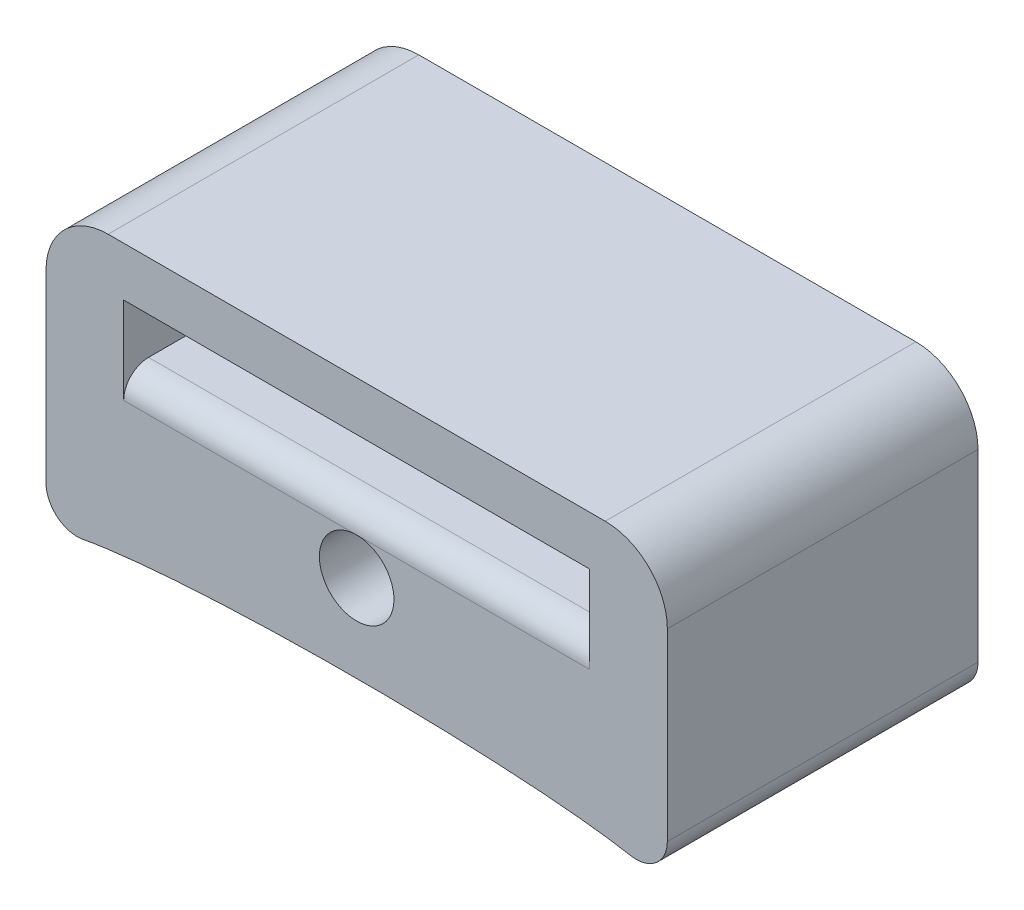
ISO-10303-21;
HEADER;
FILE_DESCRIPTION(('STEP AP214'),'2;1');
FILE_NAME('part.step','',(''),(''),'','','');
FILE_SCHEMA(('AUTOMOTIVE_DESIGN { 1 0 10303 214 1 1 1 1 }'));
ENDSEC;
DATA;
#1=APPLICATION_CONTEXT('core data for automotive mechanical design processes');
#2=APPLICATION_PROTOCOL_DEFINITION('international standard','automotive_design',2000,#1);
#3=PRODUCT_CONTEXT('',#1,'mechanical');
#4=PRODUCT('Part','Part','',(#3));
#5=PRODUCT_RELATED_PRODUCT_CATEGORY('part','',(#4));
#6=PRODUCT_DEFINITION_FORMATION('','',#4);
#7=PRODUCT_DEFINITION_CONTEXT('part definition',#1,'design');
#8=PRODUCT_DEFINITION('design','',#6,#7);
#9=PRODUCT_DEFINITION_SHAPE('','',#8);
#10=(LENGTH_UNIT() NAMED_UNIT(*) SI_UNIT(.MILLI.,.METRE.));
#11=(NAMED_UNIT(*) PLANE_ANGLE_UNIT() SI_UNIT($,.RADIAN.));
#12=(NAMED_UNIT(*) SI_UNIT($,.STERADIAN.) SOLID_ANGLE_UNIT());
#13=UNCERTAINTY_MEASURE_WITH_UNIT(LENGTH_MEASURE(1.E-05),#10,'distance_accuracy_value','');
#14=(GEOMETRIC_REPRESENTATION_CONTEXT(3) GLOBAL_UNCERTAINTY_ASSIGNED_CONTEXT((#13)) GLOBAL_UNIT_ASSIGNED_CONTEXT((#10,
#11,#12)) REPRESENTATION_CONTEXT('',''));
#15=CARTESIAN_POINT('',(0.,0.,0.));
#16=DIRECTION('',(0.,0.,1.));
#17=DIRECTION('',(1.,0.,0.));
#18=AXIS2_PLACEMENT_3D('',#15,#16,#17);
#19=CARTESIAN_POINT('',(-141.503596574538,5.,36.8424613526861));
#20=DIRECTION('',(1.,0.,0.));
#21=DIRECTION('',(0.,0.,-1.));
#22=AXIS2_PLACEMENT_3D('',#19,#20,#21);
#23=PLANE('',#22);
#24=DIRECTION('',(0.,-1.,0.));
#25=VECTOR('',#24,1.);
#26=CARTESIAN_POINT('',(-141.503596574538,5.,41.842461352686));
#27=LINE('',#26,#25);
#28=CARTESIAN_POINT('',(-141.503596574538,3.69200046956964,41.842461352686));
#29=VERTEX_POINT('',#28);
#30=CARTESIAN_POINT('',(-141.503596574538,0.727461803349973,41.842461352686));
#31=VERTEX_POINT('',#30);
#32=EDGE_CURVE('E215',#29,#31,#27,.T.);
#33=ORIENTED_EDGE('',*,*,#32,.F.);
#34=DIRECTION('',(0.,0.,1.));
#35=VECTOR('',#34,1.);
#36=CARTESIAN_POINT('',(-141.503596574538,3.69200046956964,36.8424613526861));
#37=LINE('',#36,#35);
#38=CARTESIAN_POINT('',(-141.503596574538,3.69200046956964,36.8424613526861));
#39=VERTEX_POINT('',#38);
#40=EDGE_CURVE('E272',#29,#39,#37,.F.);
#41=ORIENTED_EDGE('',*,*,#40,.T.);
#42=DIRECTION('',(0.,-1.,0.));
#43=VECTOR('',#42,1.);
#44=CARTESIAN_POINT('',(-141.503596574538,5.,36.8424613526861));
#45=LINE('',#44,#43);
#46=CARTESIAN_POINT('',(-141.503596574538,0.727461803349973,36.8424613526861));
#47=VERTEX_POINT('',#46);
#48=EDGE_CURVE('E206',#39,#47,#45,.T.);
#49=ORIENTED_EDGE('',*,*,#48,.T.);
#50=DIRECTION('',(0.,0.,1.));
#51=VECTOR('',#50,1.);
#52=CARTESIAN_POINT('',(-141.503596574538,0.727461803349973,36.8424613526861));
#53=LINE('',#52,#51);
#54=EDGE_CURVE('E231',#47,#31,#53,.T.);
#55=ORIENTED_EDGE('',*,*,#54,.T.);
#56=EDGE_LOOP('',(#33,#41,#49,#55));
#57=FACE_BOUND('',#56,.T.);
#58=ADVANCED_FACE('F45',(#57),#23,.F.);
#59=CARTESIAN_POINT('',(-141.503596574538,5.,41.842461352686));
#60=DIRECTION('',(0.,0.,-1.));
#61=DIRECTION('',(-1.,0.,0.));
#62=AXIS2_PLACEMENT_3D('',#59,#60,#61);
#63=PLANE('',#62);
#64=DIRECTION('',(0.,1.,0.));
#65=VECTOR('',#64,1.);
#66=CARTESIAN_POINT('',(-132.753596574538,0.,41.842461352686));
#67=LINE('',#66,#65);
#68=CARTESIAN_POINT('',(-132.753596574538,2.49999999999999,41.842461352686));
#69=VERTEX_POINT('',#68);
#70=CARTESIAN_POINT('',(-132.753596574538,3.89999999999999,41.842461352686));
#71=VERTEX_POINT('',#70);
#72=EDGE_CURVE('E166',#69,#71,#67,.T.);
#73=ORIENTED_EDGE('',*,*,#72,.F.);
#74=DIRECTION('',(1.,0.,0.));
#75=VECTOR('',#74,1.);
#76=CARTESIAN_POINT('',(-141.503596574538,2.49999999999999,41.842461352686));
#77=LINE('',#76,#75);
#78=CARTESIAN_POINT('',(-136.503596574538,2.49999999999999,41.842461352686));
#79=VERTEX_POINT('',#78);
#80=EDGE_CURVE('E295',#69,#79,#77,.F.);
#81=ORIENTED_EDGE('',*,*,#80,.T.);
#82=CARTESIAN_POINT('',(-136.503596574538,1.9,41.842461352686));
#83=DIRECTION('',(0.,0.,1.));
#84=DIRECTION('',(1.,0.,0.));
#85=AXIS2_PLACEMENT_3D('',#82,#83,#84);
#86=CIRCLE('',#85,0.599999999999993);
#87=EDGE_CURVE('E197',#79,#79,#86,.T.);
#88=ORIENTED_EDGE('',*,*,#87,.F.);
#89=DIRECTION('',(1.,0.,0.));
#90=VECTOR('',#89,1.);
#91=CARTESIAN_POINT('',(-141.503596574538,2.49999999999999,41.842461352686));
#92=LINE('',#91,#90);
#93=CARTESIAN_POINT('',(-140.253596574538,2.49999999999999,41.842461352686));
#94=VERTEX_POINT('',#93);
#95=EDGE_CURVE('E292',#79,#94,#92,.F.);
#96=ORIENTED_EDGE('',*,*,#95,.T.);
#97=DIRECTION('',(0.,1.,0.));
#98=VECTOR('',#97,1.);
#99=CARTESIAN_POINT('',(-140.253596574538,0.,41.842461352686));
#100=LINE('',#99,#98);
#101=CARTESIAN_POINT('',(-140.253596574538,3.89999999999999,41.842461352686));
#102=VERTEX_POINT('',#101);
#103=EDGE_CURVE('E178',#94,#102,#100,.T.);
#104=ORIENTED_EDGE('',*,*,#103,.T.);
#105=DIRECTION('',(1.,0.,0.));
#106=VECTOR('',#105,1.);
#107=CARTESIAN_POINT('',(0.,3.89999999999999,41.842461352686));
#108=LINE('',#107,#106);
#109=EDGE_CURVE('E158',#102,#71,#108,.T.);
#110=ORIENTED_EDGE('',*,*,#109,.T.);
#111=EDGE_LOOP('',(#73,#81,#88,#96,#104,#110));
#112=FACE_BOUND('',#111,.T.);
#113=DIRECTION('',(-1.,0.,0.));
#114=VECTOR('',#113,1.);
#115=CARTESIAN_POINT('',(0.,4.69200046956964,41.842461352686));
#116=LINE('',#115,#114);
#117=CARTESIAN_POINT('',(-132.503596574538,4.69200046956964,41.842461352686));
#118=VERTEX_POINT('',#117);
#119=CARTESIAN_POINT('',(-140.503596574538,4.69200046956964,41.842461352686));
#120=VERTEX_POINT('',#119);
#121=EDGE_CURVE('E173',#118,#120,#116,.T.);
#122=ORIENTED_EDGE('',*,*,#121,.T.);
#123=CARTESIAN_POINT('',(-140.503596574538,3.69200046956964,41.842461352686));
#124=DIRECTION('',(0.,0.,-1.));
#125=DIRECTION('',(-1.,0.,0.));
#126=AXIS2_PLACEMENT_3D('',#123,#124,#125);
#127=CIRCLE('',#126,1.);
#128=EDGE_CURVE('E269',#120,#29,#127,.F.);
#129=ORIENTED_EDGE('',*,*,#128,.T.);
#130=ORIENTED_EDGE('',*,*,#32,.T.);
#131=CARTESIAN_POINT('',(-141.003596574538,0.727461803349973,41.842461352686));
#132=DIRECTION('',(0.,0.,-1.));
#133=DIRECTION('',(-1.,0.,0.));
#134=AXIS2_PLACEMENT_3D('',#131,#132,#133);
#135=CIRCLE('',#134,0.5);
#136=CARTESIAN_POINT('',(-140.911777495764,0.235964848351188,41.842461352686));
#137=VERTEX_POINT('',#136);
#138=EDGE_CURVE('E239',#31,#137,#135,.F.);
#139=ORIENTED_EDGE('',*,*,#138,.T.);
#140=CARTESIAN_POINT('',(-136.503596574538,0.,41.842461352686));
#141=DIRECTION('',(0.,0.,1.));
#142=DIRECTION('',(1.,0.,0.));
#143=AXIS2_PLACEMENT_3D('',#140,#141,#142);
#144=ELLIPSE('',#143,5.,0.5);
#145=CARTESIAN_POINT('',(-132.095415653312,0.235964848351188,41.842461352686));
#146=VERTEX_POINT('',#145);
#147=EDGE_CURVE('E189',#146,#137,#144,.T.);
#148=ORIENTED_EDGE('',*,*,#147,.F.);
#149=CARTESIAN_POINT('',(-132.003596574538,0.727461803349973,41.842461352686));
#150=DIRECTION('',(0.,0.,-1.));
#151=DIRECTION('',(-1.,0.,0.));
#152=AXIS2_PLACEMENT_3D('',#149,#150,#151);
#153=CIRCLE('',#152,0.5);
#154=CARTESIAN_POINT('',(-131.503596574538,0.727461803349973,41.842461352686));
#155=VERTEX_POINT('',#154);
#156=EDGE_CURVE('E235',#146,#155,#153,.F.);
#157=ORIENTED_EDGE('',*,*,#156,.T.);
#158=DIRECTION('',(0.,-1.,0.));
#159=VECTOR('',#158,1.);
#160=CARTESIAN_POINT('',(-131.503596574538,5.,41.842461352686));
#161=LINE('',#160,#159);
#162=CARTESIAN_POINT('',(-131.503596574538,3.69200046956964,41.842461352686));
#163=VERTEX_POINT('',#162);
#164=EDGE_CURVE('E212',#163,#155,#161,.T.);
#165=ORIENTED_EDGE('',*,*,#164,.F.);
#166=CARTESIAN_POINT('',(-132.503596574538,3.69200046956964,41.842461352686));
#167=DIRECTION('',(0.,0.,-1.));
#168=DIRECTION('',(-1.,0.,0.));
#169=AXIS2_PLACEMENT_3D('',#166,#167,#168);
#170=CIRCLE('',#169,1.);
#171=EDGE_CURVE('E266',#163,#118,#170,.F.);
#172=ORIENTED_EDGE('',*,*,#171,.T.);
#173=EDGE_LOOP('',(#122,#129,#130,#139,#148,#157,#165,#172));
#174=FACE_BOUND('',#173,.T.);
#175=ADVANCED_FACE('F175',(#112,#174),#63,.F.);
#176=CARTESIAN_POINT('',(-131.503596574538,5.,36.8424613526861));
#177=DIRECTION('',(-1.,0.,0.));
#178=DIRECTION('',(0.,0.,1.));
#179=AXIS2_PLACEMENT_3D('',#176,#177,#178);
#180=PLANE('',#179);
#181=DIRECTION('',(0.,-1.,0.));
#182=VECTOR('',#181,1.);
#183=CARTESIAN_POINT('',(-131.503596574538,5.,36.8424613526861));
#184=LINE('',#183,#182);
#185=CARTESIAN_POINT('',(-131.503596574538,3.69200046956964,36.8424613526861));
#186=VERTEX_POINT('',#185);
#187=CARTESIAN_POINT('',(-131.503596574538,0.727461803349973,36.8424613526861));
#188=VERTEX_POINT('',#187);
#189=EDGE_CURVE('E209',#186,#188,#184,.T.);
#190=ORIENTED_EDGE('',*,*,#189,.F.);
#191=DIRECTION('',(0.,0.,1.));
#192=VECTOR('',#191,1.);
#193=CARTESIAN_POINT('',(-131.503596574538,3.69200046956964,41.842461352686));
#194=LINE('',#193,#192);
#195=EDGE_CURVE('E281',#186,#163,#194,.T.);
#196=ORIENTED_EDGE('',*,*,#195,.T.);
#197=ORIENTED_EDGE('',*,*,#164,.T.);
#198=DIRECTION('',(0.,0.,1.));
#199=VECTOR('',#198,1.);
#200=CARTESIAN_POINT('',(-131.503596574538,0.727461803349973,36.8424613526861));
#201=LINE('',#200,#199);
#202=EDGE_CURVE('E255',#155,#188,#201,.F.);
#203=ORIENTED_EDGE('',*,*,#202,.T.);
#204=EDGE_LOOP('',(#190,#196,#197,#203));
#205=FACE_BOUND('',#204,.T.);
#206=ADVANCED_FACE('F337',(#205),#180,.F.);
#207=CARTESIAN_POINT('',(-141.503596574538,5.,36.8424613526861));
#208=DIRECTION('',(0.,0.,1.));
#209=DIRECTION('',(1.,0.,0.));
#210=AXIS2_PLACEMENT_3D('',#207,#208,#209);
#211=PLANE('',#210);
#212=DIRECTION('',(1.,0.,0.));
#213=VECTOR('',#212,1.);
#214=CARTESIAN_POINT('',(-141.503596574538,2.49999999999999,36.8424613526861));
#215=LINE('',#214,#213);
#216=CARTESIAN_POINT('',(-136.503596574538,2.49999999999999,36.8424613526861));
#217=VERTEX_POINT('',#216);
#218=CARTESIAN_POINT('',(-132.753596574538,2.49999999999999,36.8424613526861));
#219=VERTEX_POINT('',#218);
#220=EDGE_CURVE('E301',#217,#219,#215,.T.);
#221=ORIENTED_EDGE('',*,*,#220,.T.);
#222=DIRECTION('',(0.,1.,0.));
#223=VECTOR('',#222,1.);
#224=CARTESIAN_POINT('',(-132.753596574538,5.,36.8424613526861));
#225=LINE('',#224,#223);
#226=CARTESIAN_POINT('',(-132.753596574538,3.89999999999999,36.8424613526861));
#227=VERTEX_POINT('',#226);
#228=EDGE_CURVE('E61',#219,#227,#225,.T.);
#229=ORIENTED_EDGE('',*,*,#228,.T.);
#230=DIRECTION('',(1.,0.,0.));
#231=VECTOR('',#230,1.);
#232=CARTESIAN_POINT('',(-141.503596574538,3.89999999999999,36.8424613526861));
#233=LINE('',#232,#231);
#234=CARTESIAN_POINT('',(-140.253596574538,3.89999999999999,36.8424613526861));
#235=VERTEX_POINT('',#234);
#236=EDGE_CURVE('E160',#235,#227,#233,.T.);
#237=ORIENTED_EDGE('',*,*,#236,.F.);
#238=DIRECTION('',(0.,1.,0.));
#239=VECTOR('',#238,1.);
#240=CARTESIAN_POINT('',(-140.253596574538,5.,36.8424613526861));
#241=LINE('',#240,#239);
#242=CARTESIAN_POINT('',(-140.253596574538,2.49999999999999,36.8424613526861));
#243=VERTEX_POINT('',#242);
#244=EDGE_CURVE('E69',#243,#235,#241,.T.);
#245=ORIENTED_EDGE('',*,*,#244,.F.);
#246=DIRECTION('',(1.,0.,0.));
#247=VECTOR('',#246,1.);
#248=CARTESIAN_POINT('',(-141.503596574538,2.49999999999999,36.8424613526861));
#249=LINE('',#248,#247);
#250=EDGE_CURVE('E298',#243,#217,#249,.T.);
#251=ORIENTED_EDGE('',*,*,#250,.T.);
#252=CARTESIAN_POINT('',(-136.503596574538,1.9,36.8424613526861));
#253=DIRECTION('',(0.,0.,1.));
#254=DIRECTION('',(1.,0.,0.));
#255=AXIS2_PLACEMENT_3D('',#252,#253,#254);
#256=CIRCLE('',#255,0.599999999999993);
#257=EDGE_CURVE('E205',#217,#217,#256,.T.);
#258=ORIENTED_EDGE('',*,*,#257,.T.);
#259=EDGE_LOOP('',(#221,#229,#237,#245,#251,#258));
#260=FACE_BOUND('',#259,.T.);
#261=ORIENTED_EDGE('',*,*,#48,.F.);
#262=CARTESIAN_POINT('',(-140.503596574538,3.69200046956964,36.8424613526861));
#263=DIRECTION('',(0.,0.,1.));
#264=DIRECTION('',(1.,0.,0.));
#265=AXIS2_PLACEMENT_3D('',#262,#263,#264);
#266=CIRCLE('',#265,1.);
#267=CARTESIAN_POINT('',(-140.503596574538,4.69200046956964,36.8424613526861));
#268=VERTEX_POINT('',#267);
#269=EDGE_CURVE('E278',#39,#268,#266,.F.);
#270=ORIENTED_EDGE('',*,*,#269,.T.);
#271=DIRECTION('',(-1.,0.,0.));
#272=VECTOR('',#271,1.);
#273=CARTESIAN_POINT('',(-141.503596574538,4.69200046956964,36.8424613526861));
#274=LINE('',#273,#272);
#275=CARTESIAN_POINT('',(-132.503596574538,4.69200046956964,36.8424613526861));
#276=VERTEX_POINT('',#275);
#277=EDGE_CURVE('E218',#276,#268,#274,.T.);
#278=ORIENTED_EDGE('',*,*,#277,.F.);
#279=CARTESIAN_POINT('',(-132.503596574538,3.69200046956964,36.8424613526861));
#280=DIRECTION('',(0.,0.,1.));
#281=DIRECTION('',(1.,0.,0.));
#282=AXIS2_PLACEMENT_3D('',#279,#280,#281);
#283=CIRCLE('',#282,1.);
#284=EDGE_CURVE('E275',#276,#186,#283,.F.);
#285=ORIENTED_EDGE('',*,*,#284,.T.);
#286=ORIENTED_EDGE('',*,*,#189,.T.);
#287=CARTESIAN_POINT('',(-132.003596574538,0.727461803349973,36.8424613526861));
#288=DIRECTION('',(0.,0.,1.));
#289=DIRECTION('',(1.,0.,0.));
#290=AXIS2_PLACEMENT_3D('',#287,#288,#289);
#291=CIRCLE('',#290,0.5);
#292=CARTESIAN_POINT('',(-132.095415653312,0.235964848351188,36.8424613526861));
#293=VERTEX_POINT('',#292);
#294=EDGE_CURVE('E248',#188,#293,#291,.F.);
#295=ORIENTED_EDGE('',*,*,#294,.T.);
#296=CARTESIAN_POINT('',(-136.503596574538,0.,36.8424613526861));
#297=DIRECTION('',(0.,0.,1.));
#298=DIRECTION('',(1.,0.,0.));
#299=AXIS2_PLACEMENT_3D('',#296,#297,#298);
#300=ELLIPSE('',#299,5.,0.5);
#301=CARTESIAN_POINT('',(-140.911777495764,0.235964848351188,36.8424613526861));
#302=VERTEX_POINT('',#301);
#303=EDGE_CURVE('E201',#293,#302,#300,.T.);
#304=ORIENTED_EDGE('',*,*,#303,.T.);
#305=CARTESIAN_POINT('',(-141.003596574538,0.727461803349973,36.8424613526861));
#306=DIRECTION('',(0.,0.,1.));
#307=DIRECTION('',(1.,0.,0.));
#308=AXIS2_PLACEMENT_3D('',#305,#306,#307);
#309=CIRCLE('',#308,0.5);
#310=EDGE_CURVE('E251',#302,#47,#309,.F.);
#311=ORIENTED_EDGE('',*,*,#310,.T.);
#312=EDGE_LOOP('',(#261,#270,#278,#285,#286,#295,#304,#311));
#313=FACE_BOUND('',#312,.T.);
#314=ADVANCED_FACE('F334',(#260,#313),#211,.F.);
#315=CARTESIAN_POINT('',(-136.503596574538,0.,31.842461352686));
#316=DIRECTION('',(0.,0.,1.));
#317=DIRECTION('',(1.,0.,0.));
#318=AXIS2_PLACEMENT_3D('',#315,#316,#317);
#319=ELLIPSE('',#318,5.,0.5);
#320=DIRECTION('',(0.,0.,1.));
#321=VECTOR('',#320,1.);
#322=SURFACE_OF_LINEAR_EXTRUSION('',#319,#321);
#323=ORIENTED_EDGE('',*,*,#147,.T.);
#324=DIRECTION('',(0.,0.,1.));
#325=VECTOR('',#324,1.);
#326=CARTESIAN_POINT('',(-140.911777495764,0.235964848351188,41.842461352686));
#327=LINE('',#326,#325);
#328=EDGE_CURVE('E245',#137,#302,#327,.F.);
#329=ORIENTED_EDGE('',*,*,#328,.T.);
#330=ORIENTED_EDGE('',*,*,#303,.F.);
#331=DIRECTION('',(0.,0.,1.));
#332=VECTOR('',#331,1.);
#333=CARTESIAN_POINT('',(-132.095415653312,0.235964848351188,36.8424613526861));
#334=LINE('',#333,#332);
#335=EDGE_CURVE('E242',#293,#146,#334,.T.);
#336=ORIENTED_EDGE('',*,*,#335,.T.);
#337=EDGE_LOOP('',(#323,#329,#330,#336));
#338=FACE_BOUND('',#337,.T.);
#339=ADVANCED_FACE('F331',(#338),#322,.F.);
#340=CARTESIAN_POINT('',(-136.503596574538,1.9,31.842461352686));
#341=DIRECTION('',(0.,0.,1.));
#342=DIRECTION('',(1.,0.,0.));
#343=AXIS2_PLACEMENT_3D('',#340,#341,#342);
#344=CYLINDRICAL_SURFACE('',#343,0.599999999999993);
#345=ORIENTED_EDGE('',*,*,#87,.T.);
#346=EDGE_LOOP('',(#345));
#347=FACE_BOUND('',#346,.T.);
#348=ORIENTED_EDGE('',*,*,#257,.F.);
#349=EDGE_LOOP('',(#348));
#350=FACE_BOUND('',#349,.T.);
#351=ADVANCED_FACE('F327',(#347,#350),#344,.F.);
#352=CARTESIAN_POINT('',(0.,4.69200046956964,31.842461352686));
#353=DIRECTION('',(0.,1.,0.));
#354=DIRECTION('',(0.,0.,1.));
#355=AXIS2_PLACEMENT_3D('',#352,#353,#354);
#356=PLANE('',#355);
#357=ORIENTED_EDGE('',*,*,#277,.T.);
#358=DIRECTION('',(0.,0.,1.));
#359=VECTOR('',#358,1.);
#360=CARTESIAN_POINT('',(-140.503596574538,4.69200046956964,41.842461352686));
#361=LINE('',#360,#359);
#362=EDGE_CURVE('E262',#268,#120,#361,.T.);
#363=ORIENTED_EDGE('',*,*,#362,.T.);
#364=ORIENTED_EDGE('',*,*,#121,.F.);
#365=DIRECTION('',(0.,0.,1.));
#366=VECTOR('',#365,1.);
#367=CARTESIAN_POINT('',(-132.503596574538,4.69200046956964,36.8424613526861));
#368=LINE('',#367,#366);
#369=EDGE_CURVE('E259',#118,#276,#368,.F.);
#370=ORIENTED_EDGE('',*,*,#369,.T.);
#371=EDGE_LOOP('',(#357,#363,#364,#370));
#372=FACE_BOUND('',#371,.T.);
#373=ADVANCED_FACE('F330',(#372),#356,.T.);
#374=CARTESIAN_POINT('',(0.,2.89999999999999,31.842461352686));
#375=DIRECTION('',(0.,-1.,0.));
#376=DIRECTION('',(0.,0.,-1.));
#377=AXIS2_PLACEMENT_3D('',#374,#375,#376);
#378=PLANE('',#377);
#379=DIRECTION('',(0.,0.,1.));
#380=VECTOR('',#379,1.);
#381=CARTESIAN_POINT('',(-140.253596574538,2.89999999999999,31.842461352686));
#382=LINE('',#381,#380);
#383=CARTESIAN_POINT('',(-140.253596574538,2.89999999999999,37.242461352686));
#384=VERTEX_POINT('',#383);
#385=CARTESIAN_POINT('',(-140.253596574538,2.89999999999999,41.442461352686));
#386=VERTEX_POINT('',#385);
#387=EDGE_CURVE('E185',#384,#386,#382,.T.);
#388=ORIENTED_EDGE('',*,*,#387,.T.);
#389=DIRECTION('',(1.,0.,0.));
#390=VECTOR('',#389,1.);
#391=CARTESIAN_POINT('',(0.,2.89999999999999,41.442461352686));
#392=LINE('',#391,#390);
#393=CARTESIAN_POINT('',(-132.753596574538,2.89999999999999,41.442461352686));
#394=VERTEX_POINT('',#393);
#395=EDGE_CURVE('E288',#386,#394,#392,.T.);
#396=ORIENTED_EDGE('',*,*,#395,.T.);
#397=DIRECTION('',(0.,0.,1.));
#398=VECTOR('',#397,1.);
#399=CARTESIAN_POINT('',(-132.753596574538,2.89999999999999,31.842461352686));
#400=LINE('',#399,#398);
#401=CARTESIAN_POINT('',(-132.753596574538,2.89999999999999,37.242461352686));
#402=VERTEX_POINT('',#401);
#403=EDGE_CURVE('E163',#402,#394,#400,.T.);
#404=ORIENTED_EDGE('',*,*,#403,.F.);
#405=DIRECTION('',(1.,0.,0.));
#406=VECTOR('',#405,1.);
#407=CARTESIAN_POINT('',(0.,2.89999999999999,37.242461352686));
#408=LINE('',#407,#406);
#409=EDGE_CURVE('E285',#402,#384,#408,.F.);
#410=ORIENTED_EDGE('',*,*,#409,.T.);
#411=EDGE_LOOP('',(#388,#396,#404,#410));
#412=FACE_BOUND('',#411,.T.);
#413=ADVANCED_FACE('F314',(#412),#378,.F.);
#414=CARTESIAN_POINT('',(-140.253596574538,0.,31.842461352686));
#415=DIRECTION('',(1.,0.,0.));
#416=DIRECTION('',(0.,0.,-1.));
#417=AXIS2_PLACEMENT_3D('',#414,#415,#416);
#418=PLANE('',#417);
#419=ORIENTED_EDGE('',*,*,#244,.T.);
#420=DIRECTION('',(0.,0.,1.));
#421=VECTOR('',#420,1.);
#422=CARTESIAN_POINT('',(-140.253596574538,3.89999999999999,31.842461352686));
#423=LINE('',#422,#421);
#424=EDGE_CURVE('E162',#235,#102,#423,.T.);
#425=ORIENTED_EDGE('',*,*,#424,.T.);
#426=ORIENTED_EDGE('',*,*,#103,.F.);
#427=CARTESIAN_POINT('',(-140.253596574538,2.49999999999999,41.442461352686));
#428=DIRECTION('',(1.,0.,0.));
#429=DIRECTION('',(0.,0.,-1.));
#430=AXIS2_PLACEMENT_3D('',#427,#428,#429);
#431=CIRCLE('',#430,0.4);
#432=EDGE_CURVE('E306',#94,#386,#431,.F.);
#433=ORIENTED_EDGE('',*,*,#432,.T.);
#434=ORIENTED_EDGE('',*,*,#387,.F.);
#435=CARTESIAN_POINT('',(-140.253596574538,2.49999999999999,37.242461352686));
#436=DIRECTION('',(1.,0.,0.));
#437=DIRECTION('',(0.,0.,-1.));
#438=AXIS2_PLACEMENT_3D('',#435,#436,#437);
#439=CIRCLE('',#438,0.4);
#440=EDGE_CURVE('E11',#384,#243,#439,.F.);
#441=ORIENTED_EDGE('',*,*,#440,.T.);
#442=EDGE_LOOP('',(#419,#425,#426,#433,#434,#441));
#443=FACE_BOUND('',#442,.T.);
#444=ADVANCED_FACE('F320',(#443),#418,.T.);
#445=CARTESIAN_POINT('',(0.,3.89999999999999,31.842461352686));
#446=DIRECTION('',(0.,-1.,0.));
#447=DIRECTION('',(0.,0.,-1.));
#448=AXIS2_PLACEMENT_3D('',#445,#446,#447);
#449=PLANE('',#448);
#450=ORIENTED_EDGE('',*,*,#236,.T.);
#451=DIRECTION('',(0.,0.,1.));
#452=VECTOR('',#451,1.);
#453=CARTESIAN_POINT('',(-132.753596574538,3.89999999999999,31.842461352686));
#454=LINE('',#453,#452);
#455=EDGE_CURVE('E153',#227,#71,#454,.T.);
#456=ORIENTED_EDGE('',*,*,#455,.T.);
#457=ORIENTED_EDGE('',*,*,#109,.F.);
#458=ORIENTED_EDGE('',*,*,#424,.F.);
#459=EDGE_LOOP('',(#450,#456,#457,#458));
#460=FACE_BOUND('',#459,.T.);
#461=ADVANCED_FACE('F155',(#460),#449,.T.);
#462=CARTESIAN_POINT('',(-132.753596574538,0.,31.842461352686));
#463=DIRECTION('',(1.,0.,0.));
#464=DIRECTION('',(0.,0.,-1.));
#465=AXIS2_PLACEMENT_3D('',#462,#463,#464);
#466=PLANE('',#465);
#467=ORIENTED_EDGE('',*,*,#228,.F.);
#468=CARTESIAN_POINT('',(-132.753596574538,2.49999999999999,37.242461352686));
#469=DIRECTION('',(1.,0.,0.));
#470=DIRECTION('',(0.,0.,-1.));
#471=AXIS2_PLACEMENT_3D('',#468,#469,#470);
#472=CIRCLE('',#471,0.4);
#473=EDGE_CURVE('E54',#219,#402,#472,.T.);
#474=ORIENTED_EDGE('',*,*,#473,.T.);
#475=ORIENTED_EDGE('',*,*,#403,.T.);
#476=CARTESIAN_POINT('',(-132.753596574538,2.49999999999999,41.442461352686));
#477=DIRECTION('',(1.,0.,0.));
#478=DIRECTION('',(0.,0.,-1.));
#479=AXIS2_PLACEMENT_3D('',#476,#477,#478);
#480=CIRCLE('',#479,0.4);
#481=EDGE_CURVE('E169',#394,#69,#480,.T.);
#482=ORIENTED_EDGE('',*,*,#481,.T.);
#483=ORIENTED_EDGE('',*,*,#72,.T.);
#484=ORIENTED_EDGE('',*,*,#455,.F.);
#485=EDGE_LOOP('',(#467,#474,#475,#482,#483,#484));
#486=FACE_BOUND('',#485,.T.);
#487=ADVANCED_FACE('F167',(#486),#466,.F.);
#488=CARTESIAN_POINT('',(-141.003596574538,0.727461803349973,39.3424613526861));
#489=DIRECTION('',(0.,0.,1.));
#490=DIRECTION('',(1.,0.,0.));
#491=AXIS2_PLACEMENT_3D('',#488,#489,#490);
#492=CYLINDRICAL_SURFACE('',#491,0.5);
#493=ORIENTED_EDGE('',*,*,#310,.F.);
#494=ORIENTED_EDGE('',*,*,#328,.F.);
#495=ORIENTED_EDGE('',*,*,#138,.F.);
#496=ORIENTED_EDGE('',*,*,#54,.F.);
#497=EDGE_LOOP('',(#493,#494,#495,#496));
#498=FACE_BOUND('',#497,.T.);
#499=ADVANCED_FACE('F384',(#498),#492,.T.);
#500=CARTESIAN_POINT('',(-132.003596574538,0.727461803349973,39.3424613526861));
#501=DIRECTION('',(0.,0.,1.));
#502=DIRECTION('',(1.,0.,0.));
#503=AXIS2_PLACEMENT_3D('',#500,#501,#502);
#504=CYLINDRICAL_SURFACE('',#503,0.5);
#505=ORIENTED_EDGE('',*,*,#156,.F.);
#506=ORIENTED_EDGE('',*,*,#335,.F.);
#507=ORIENTED_EDGE('',*,*,#294,.F.);
#508=ORIENTED_EDGE('',*,*,#202,.F.);
#509=EDGE_LOOP('',(#505,#506,#507,#508));
#510=FACE_BOUND('',#509,.T.);
#511=ADVANCED_FACE('F366',(#510),#504,.T.);
#512=CARTESIAN_POINT('',(-140.503596574538,3.69200046956964,31.842461352686));
#513=DIRECTION('',(0.,0.,-1.));
#514=DIRECTION('',(-1.,0.,0.));
#515=AXIS2_PLACEMENT_3D('',#512,#513,#514);
#516=CYLINDRICAL_SURFACE('',#515,1.);
#517=ORIENTED_EDGE('',*,*,#269,.F.);
#518=ORIENTED_EDGE('',*,*,#40,.F.);
#519=ORIENTED_EDGE('',*,*,#128,.F.);
#520=ORIENTED_EDGE('',*,*,#362,.F.);
#521=EDGE_LOOP('',(#517,#518,#519,#520));
#522=FACE_BOUND('',#521,.T.);
#523=ADVANCED_FACE('F348',(#522),#516,.T.);
#524=CARTESIAN_POINT('',(-132.503596574538,3.69200046956964,36.8424613526861));
#525=DIRECTION('',(0.,0.,-1.));
#526=DIRECTION('',(-1.,0.,0.));
#527=AXIS2_PLACEMENT_3D('',#524,#525,#526);
#528=CYLINDRICAL_SURFACE('',#527,1.);
#529=ORIENTED_EDGE('',*,*,#284,.F.);
#530=ORIENTED_EDGE('',*,*,#369,.F.);
#531=ORIENTED_EDGE('',*,*,#171,.F.);
#532=ORIENTED_EDGE('',*,*,#195,.F.);
#533=EDGE_LOOP('',(#529,#530,#531,#532));
#534=FACE_BOUND('',#533,.T.);
#535=ADVANCED_FACE('F357',(#534),#528,.T.);
#536=CARTESIAN_POINT('',(0.,2.49999999999999,41.442461352686));
#537=DIRECTION('',(1.,0.,0.));
#538=DIRECTION('',(0.,0.,-1.));
#539=AXIS2_PLACEMENT_3D('',#536,#537,#538);
#540=CYLINDRICAL_SURFACE('',#539,0.4);
#541=ORIENTED_EDGE('',*,*,#95,.F.);
#542=ORIENTED_EDGE('',*,*,#80,.F.);
#543=ORIENTED_EDGE('',*,*,#481,.F.);
#544=ORIENTED_EDGE('',*,*,#395,.F.);
#545=ORIENTED_EDGE('',*,*,#432,.F.);
#546=EDGE_LOOP('',(#541,#542,#543,#544,#545));
#547=FACE_BOUND('',#546,.T.);
#548=ADVANCED_FACE('F324',(#547),#540,.T.);
#549=CARTESIAN_POINT('',(-141.503596574538,2.49999999999999,37.242461352686));
#550=DIRECTION('',(1.,0.,0.));
#551=DIRECTION('',(0.,0.,-1.));
#552=AXIS2_PLACEMENT_3D('',#549,#550,#551);
#553=CYLINDRICAL_SURFACE('',#552,0.4);
#554=ORIENTED_EDGE('',*,*,#440,.F.);
#555=ORIENTED_EDGE('',*,*,#409,.F.);
#556=ORIENTED_EDGE('',*,*,#473,.F.);
#557=ORIENTED_EDGE('',*,*,#220,.F.);
#558=ORIENTED_EDGE('',*,*,#250,.F.);
#559=EDGE_LOOP('',(#554,#555,#556,#557,#558));
#560=FACE_BOUND('',#559,.T.);
#561=ADVANCED_FACE('F47',(#560),#553,.T.);
#562=CLOSED_SHELL('',(#58,#175,#206,#314,#339,#351,#373,#413,#444,#461,#487,#499,#511,#523,#535,
#548,#561));
#563=MANIFOLD_SOLID_BREP('B2',#562);
#564=ADVANCED_BREP_SHAPE_REPRESENTATION('',(#18,#563),#14);
#565=SHAPE_DEFINITION_REPRESENTATION(#9,#564);
ENDSEC;
END-ISO-10303-21;
